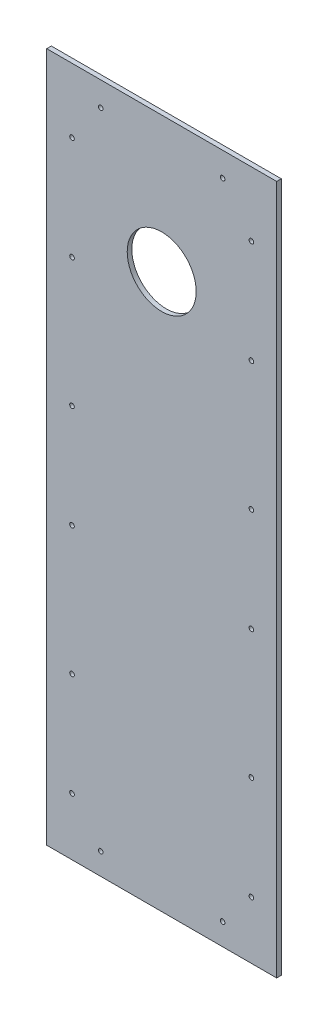
ISO-10303-21;
HEADER;
FILE_DESCRIPTION(('STEP AP214'),'2;1');
FILE_NAME('part.step','',(''),(''),'','','');
FILE_SCHEMA(('AUTOMOTIVE_DESIGN { 1 0 10303 214 1 1 1 1 }'));
ENDSEC;
DATA;
#1=APPLICATION_CONTEXT('core data for automotive mechanical design processes');
#2=APPLICATION_PROTOCOL_DEFINITION('international standard','automotive_design',2000,#1);
#3=PRODUCT_CONTEXT('',#1,'mechanical');
#4=PRODUCT('Part','Part','',(#3));
#5=PRODUCT_RELATED_PRODUCT_CATEGORY('part','',(#4));
#6=PRODUCT_DEFINITION_FORMATION('','',#4);
#7=PRODUCT_DEFINITION_CONTEXT('part definition',#1,'design');
#8=PRODUCT_DEFINITION('design','',#6,#7);
#9=PRODUCT_DEFINITION_SHAPE('','',#8);
#10=(LENGTH_UNIT() NAMED_UNIT(*) SI_UNIT(.MILLI.,.METRE.));
#11=(NAMED_UNIT(*) PLANE_ANGLE_UNIT() SI_UNIT($,.RADIAN.));
#12=(NAMED_UNIT(*) SI_UNIT($,.STERADIAN.) SOLID_ANGLE_UNIT());
#13=UNCERTAINTY_MEASURE_WITH_UNIT(LENGTH_MEASURE(1.E-05),#10,'distance_accuracy_value','');
#14=(GEOMETRIC_REPRESENTATION_CONTEXT(3) GLOBAL_UNCERTAINTY_ASSIGNED_CONTEXT((#13)) GLOBAL_UNIT_ASSIGNED_CONTEXT((#10,
#11,#12)) REPRESENTATION_CONTEXT('',''));
#15=CARTESIAN_POINT('',(0.,0.,0.));
#16=DIRECTION('',(0.,0.,1.));
#17=DIRECTION('',(1.,0.,0.));
#18=AXIS2_PLACEMENT_3D('',#15,#16,#17);
#19=CARTESIAN_POINT('',(-50.,-150.,2.));
#20=DIRECTION('',(1.,0.,0.));
#21=DIRECTION('',(0.,0.,-1.));
#22=AXIS2_PLACEMENT_3D('',#19,#20,#21);
#23=PLANE('',#22);
#24=DIRECTION('',(0.,-1.,0.));
#25=VECTOR('',#24,1.);
#26=CARTESIAN_POINT('',(-50.,-150.,0.));
#27=LINE('',#26,#25);
#28=CARTESIAN_POINT('',(-50.,150.,0.));
#29=VERTEX_POINT('',#28);
#30=CARTESIAN_POINT('',(-50.,-150.,0.));
#31=VERTEX_POINT('',#30);
#32=EDGE_CURVE('E107',#29,#31,#27,.T.);
#33=ORIENTED_EDGE('',*,*,#32,.T.);
#34=DIRECTION('',(0.,0.,-1.));
#35=VECTOR('',#34,1.);
#36=CARTESIAN_POINT('',(-50.,-150.,2.));
#37=LINE('',#36,#35);
#38=CARTESIAN_POINT('',(-50.,-150.,2.));
#39=VERTEX_POINT('',#38);
#40=EDGE_CURVE('E11',#39,#31,#37,.T.);
#41=ORIENTED_EDGE('',*,*,#40,.F.);
#42=DIRECTION('',(0.,-1.,0.));
#43=VECTOR('',#42,1.);
#44=CARTESIAN_POINT('',(-50.,-150.,2.));
#45=LINE('',#44,#43);
#46=CARTESIAN_POINT('',(-50.,150.,2.));
#47=VERTEX_POINT('',#46);
#48=EDGE_CURVE('E94',#47,#39,#45,.T.);
#49=ORIENTED_EDGE('',*,*,#48,.F.);
#50=DIRECTION('',(0.,0.,-1.));
#51=VECTOR('',#50,1.);
#52=CARTESIAN_POINT('',(-50.,150.,2.));
#53=LINE('',#52,#51);
#54=EDGE_CURVE('E103',#47,#29,#53,.T.);
#55=ORIENTED_EDGE('',*,*,#54,.T.);
#56=EDGE_LOOP('',(#33,#41,#49,#55));
#57=FACE_BOUND('',#56,.T.);
#58=ADVANCED_FACE('F41',(#57),#23,.F.);
#59=CARTESIAN_POINT('',(50.,-150.,2.));
#60=DIRECTION('',(0.,1.,0.));
#61=DIRECTION('',(0.,0.,1.));
#62=AXIS2_PLACEMENT_3D('',#59,#60,#61);
#63=PLANE('',#62);
#64=DIRECTION('',(1.,0.,0.));
#65=VECTOR('',#64,1.);
#66=CARTESIAN_POINT('',(50.,-150.,0.));
#67=LINE('',#66,#65);
#68=CARTESIAN_POINT('',(50.,-150.,0.));
#69=VERTEX_POINT('',#68);
#70=EDGE_CURVE('E98',#31,#69,#67,.T.);
#71=ORIENTED_EDGE('',*,*,#70,.T.);
#72=DIRECTION('',(0.,0.,-1.));
#73=VECTOR('',#72,1.);
#74=CARTESIAN_POINT('',(50.,-150.,2.));
#75=LINE('',#74,#73);
#76=CARTESIAN_POINT('',(50.,-150.,2.));
#77=VERTEX_POINT('',#76);
#78=EDGE_CURVE('E50',#77,#69,#75,.T.);
#79=ORIENTED_EDGE('',*,*,#78,.F.);
#80=DIRECTION('',(1.,0.,0.));
#81=VECTOR('',#80,1.);
#82=CARTESIAN_POINT('',(50.,-150.,2.));
#83=LINE('',#82,#81);
#84=EDGE_CURVE('E89',#39,#77,#83,.T.);
#85=ORIENTED_EDGE('',*,*,#84,.F.);
#86=ORIENTED_EDGE('',*,*,#40,.T.);
#87=EDGE_LOOP('',(#71,#79,#85,#86));
#88=FACE_BOUND('',#87,.T.);
#89=ADVANCED_FACE('F97',(#88),#63,.F.);
#90=CARTESIAN_POINT('',(50.,-150.,2.));
#91=DIRECTION('',(-1.,0.,0.));
#92=DIRECTION('',(0.,0.,1.));
#93=AXIS2_PLACEMENT_3D('',#90,#91,#92);
#94=PLANE('',#93);
#95=DIRECTION('',(0.,1.,0.));
#96=VECTOR('',#95,1.);
#97=CARTESIAN_POINT('',(50.,-150.,0.));
#98=LINE('',#97,#96);
#99=CARTESIAN_POINT('',(50.,150.,0.));
#100=VERTEX_POINT('',#99);
#101=EDGE_CURVE('E76',#69,#100,#98,.T.);
#102=ORIENTED_EDGE('',*,*,#101,.T.);
#103=DIRECTION('',(0.,0.,-1.));
#104=VECTOR('',#103,1.);
#105=CARTESIAN_POINT('',(50.,150.,2.));
#106=LINE('',#105,#104);
#107=CARTESIAN_POINT('',(50.,150.,2.));
#108=VERTEX_POINT('',#107);
#109=EDGE_CURVE('E99',#108,#100,#106,.T.);
#110=ORIENTED_EDGE('',*,*,#109,.F.);
#111=DIRECTION('',(0.,1.,0.));
#112=VECTOR('',#111,1.);
#113=CARTESIAN_POINT('',(50.,-150.,2.));
#114=LINE('',#113,#112);
#115=EDGE_CURVE('E92',#77,#108,#114,.T.);
#116=ORIENTED_EDGE('',*,*,#115,.F.);
#117=ORIENTED_EDGE('',*,*,#78,.T.);
#118=EDGE_LOOP('',(#102,#110,#116,#117));
#119=FACE_BOUND('',#118,.T.);
#120=ADVANCED_FACE('F101',(#119),#94,.F.);
#121=CARTESIAN_POINT('',(50.,150.,2.));
#122=DIRECTION('',(0.,-1.,0.));
#123=DIRECTION('',(1.,0.,0.));
#124=AXIS2_PLACEMENT_3D('',#121,#122,#123);
#125=PLANE('',#124);
#126=DIRECTION('',(-1.,0.,0.));
#127=VECTOR('',#126,1.);
#128=CARTESIAN_POINT('',(50.,150.,0.));
#129=LINE('',#128,#127);
#130=EDGE_CURVE('E82',#100,#29,#129,.T.);
#131=ORIENTED_EDGE('',*,*,#130,.T.);
#132=ORIENTED_EDGE('',*,*,#54,.F.);
#133=DIRECTION('',(-1.,0.,0.));
#134=VECTOR('',#133,1.);
#135=CARTESIAN_POINT('',(50.,150.,2.));
#136=LINE('',#135,#134);
#137=EDGE_CURVE('E59',#108,#47,#136,.T.);
#138=ORIENTED_EDGE('',*,*,#137,.F.);
#139=ORIENTED_EDGE('',*,*,#109,.T.);
#140=EDGE_LOOP('',(#131,#132,#138,#139));
#141=FACE_BOUND('',#140,.T.);
#142=ADVANCED_FACE('F191',(#141),#125,.F.);
#143=CARTESIAN_POINT('',(0.,0.,2.));
#144=DIRECTION('',(0.,0.,1.));
#145=DIRECTION('',(1.,0.,0.));
#146=AXIS2_PLACEMENT_3D('',#143,#144,#145);
#147=PLANE('',#146);
#148=CARTESIAN_POINT('',(-26.5,139.5,2.));
#149=DIRECTION('',(0.,0.,1.));
#150=DIRECTION('',(1.,0.,0.));
#151=AXIS2_PLACEMENT_3D('',#148,#149,#150);
#152=CIRCLE('',#151,0.999999999999998);
#153=CARTESIAN_POINT('',(-25.5,139.5,2.));
#154=VERTEX_POINT('',#153);
#155=EDGE_CURVE('E350',#154,#154,#152,.T.);
#156=ORIENTED_EDGE('',*,*,#155,.F.);
#157=EDGE_LOOP('',(#156));
#158=FACE_BOUND('',#157,.T.);
#159=CARTESIAN_POINT('',(26.5,-140.5,2.));
#160=DIRECTION('',(0.,0.,1.));
#161=DIRECTION('',(1.,0.,0.));
#162=AXIS2_PLACEMENT_3D('',#159,#160,#161);
#163=CIRCLE('',#162,1.);
#164=CARTESIAN_POINT('',(27.5,-140.5,2.));
#165=VERTEX_POINT('',#164);
#166=EDGE_CURVE('E369',#165,#165,#163,.T.);
#167=ORIENTED_EDGE('',*,*,#166,.F.);
#168=EDGE_LOOP('',(#167));
#169=FACE_BOUND('',#168,.T.);
#170=CARTESIAN_POINT('',(-26.5,-140.5,2.));
#171=DIRECTION('',(0.,0.,1.));
#172=DIRECTION('',(1.,0.,0.));
#173=AXIS2_PLACEMENT_3D('',#170,#171,#172);
#174=CIRCLE('',#173,0.999999999999998);
#175=CARTESIAN_POINT('',(-25.5,-140.5,2.));
#176=VERTEX_POINT('',#175);
#177=EDGE_CURVE('E366',#176,#176,#174,.T.);
#178=ORIENTED_EDGE('',*,*,#177,.F.);
#179=EDGE_LOOP('',(#178));
#180=FACE_BOUND('',#179,.T.);
#181=CARTESIAN_POINT('',(26.5,139.5,2.));
#182=DIRECTION('',(0.,0.,1.));
#183=DIRECTION('',(1.,0.,0.));
#184=AXIS2_PLACEMENT_3D('',#181,#182,#183);
#185=CIRCLE('',#184,1.);
#186=CARTESIAN_POINT('',(27.5,139.5,2.));
#187=VERTEX_POINT('',#186);
#188=EDGE_CURVE('E357',#187,#187,#185,.T.);
#189=ORIENTED_EDGE('',*,*,#188,.F.);
#190=EDGE_LOOP('',(#189));
#191=FACE_BOUND('',#190,.T.);
#192=CARTESIAN_POINT('',(0.,91.,2.));
#193=DIRECTION('',(0.,0.,1.));
#194=DIRECTION('',(1.,0.,0.));
#195=AXIS2_PLACEMENT_3D('',#192,#193,#194);
#196=CIRCLE('',#195,15.);
#197=CARTESIAN_POINT('',(15.,91.,2.));
#198=VERTEX_POINT('',#197);
#199=EDGE_CURVE('E376',#198,#198,#196,.T.);
#200=ORIENTED_EDGE('',*,*,#199,.F.);
#201=EDGE_LOOP('',(#200));
#202=FACE_BOUND('',#201,.T.);
#203=CARTESIAN_POINT('',(-39.,-23.9999999999995,2.));
#204=DIRECTION('',(0.,0.,1.));
#205=DIRECTION('',(1.,0.,0.));
#206=AXIS2_PLACEMENT_3D('',#203,#204,#205);
#207=CIRCLE('',#206,0.999999999999998);
#208=CARTESIAN_POINT('',(-38.,-23.9999999999995,2.));
#209=VERTEX_POINT('',#208);
#210=EDGE_CURVE('E395',#209,#209,#207,.T.);
#211=ORIENTED_EDGE('',*,*,#210,.F.);
#212=EDGE_LOOP('',(#211));
#213=FACE_BOUND('',#212,.T.);
#214=CARTESIAN_POINT('',(39.,21.,2.));
#215=DIRECTION('',(0.,0.,1.));
#216=DIRECTION('',(1.,0.,0.));
#217=AXIS2_PLACEMENT_3D('',#214,#215,#216);
#218=CIRCLE('',#217,0.999999999999998);
#219=CARTESIAN_POINT('',(40.,21.,2.));
#220=VERTEX_POINT('',#219);
#221=EDGE_CURVE('E392',#220,#220,#218,.T.);
#222=ORIENTED_EDGE('',*,*,#221,.F.);
#223=EDGE_LOOP('',(#222));
#224=FACE_BOUND('',#223,.T.);
#225=CARTESIAN_POINT('',(39.,-23.9999999999995,2.));
#226=DIRECTION('',(0.,0.,1.));
#227=DIRECTION('',(1.,0.,0.));
#228=AXIS2_PLACEMENT_3D('',#225,#226,#227);
#229=CIRCLE('',#228,0.999999999999998);
#230=CARTESIAN_POINT('',(40.,-23.9999999999995,2.));
#231=VERTEX_POINT('',#230);
#232=EDGE_CURVE('E389',#231,#231,#229,.T.);
#233=ORIENTED_EDGE('',*,*,#232,.F.);
#234=EDGE_LOOP('',(#233));
#235=FACE_BOUND('',#234,.T.);
#236=CARTESIAN_POINT('',(-39.,-80.,2.));
#237=DIRECTION('',(0.,0.,1.));
#238=DIRECTION('',(1.,0.,0.));
#239=AXIS2_PLACEMENT_3D('',#236,#237,#238);
#240=CIRCLE('',#239,0.999999999999998);
#241=CARTESIAN_POINT('',(-38.,-80.,2.));
#242=VERTEX_POINT('',#241);
#243=EDGE_CURVE('E386',#242,#242,#240,.T.);
#244=ORIENTED_EDGE('',*,*,#243,.F.);
#245=EDGE_LOOP('',(#244));
#246=FACE_BOUND('',#245,.T.);
#247=CARTESIAN_POINT('',(-39.,77.0000000000005,2.));
#248=DIRECTION('',(0.,0.,1.));
#249=DIRECTION('',(1.,0.,0.));
#250=AXIS2_PLACEMENT_3D('',#247,#248,#249);
#251=CIRCLE('',#250,0.999999999999998);
#252=CARTESIAN_POINT('',(-38.,77.0000000000005,2.));
#253=VERTEX_POINT('',#252);
#254=EDGE_CURVE('E406',#253,#253,#251,.T.);
#255=ORIENTED_EDGE('',*,*,#254,.F.);
#256=EDGE_LOOP('',(#255));
#257=FACE_BOUND('',#256,.T.);
#258=CARTESIAN_POINT('',(39.,122.,2.));
#259=DIRECTION('',(0.,0.,1.));
#260=DIRECTION('',(1.,0.,0.));
#261=AXIS2_PLACEMENT_3D('',#258,#259,#260);
#262=CIRCLE('',#261,0.999999999999998);
#263=CARTESIAN_POINT('',(40.,122.,2.));
#264=VERTEX_POINT('',#263);
#265=EDGE_CURVE('E403',#264,#264,#262,.T.);
#266=ORIENTED_EDGE('',*,*,#265,.F.);
#267=EDGE_LOOP('',(#266));
#268=FACE_BOUND('',#267,.T.);
#269=CARTESIAN_POINT('',(39.,77.0000000000005,2.));
#270=DIRECTION('',(0.,0.,1.));
#271=DIRECTION('',(1.,0.,0.));
#272=AXIS2_PLACEMENT_3D('',#269,#270,#271);
#273=CIRCLE('',#272,0.999999999999998);
#274=CARTESIAN_POINT('',(40.,77.0000000000005,2.));
#275=VERTEX_POINT('',#274);
#276=EDGE_CURVE('E400',#275,#275,#273,.T.);
#277=ORIENTED_EDGE('',*,*,#276,.F.);
#278=EDGE_LOOP('',(#277));
#279=FACE_BOUND('',#278,.T.);
#280=CARTESIAN_POINT('',(-39.,21.,2.));
#281=DIRECTION('',(0.,0.,1.));
#282=DIRECTION('',(1.,0.,0.));
#283=AXIS2_PLACEMENT_3D('',#280,#281,#282);
#284=CIRCLE('',#283,0.999999999999998);
#285=CARTESIAN_POINT('',(-38.,21.,2.));
#286=VERTEX_POINT('',#285);
#287=EDGE_CURVE('E397',#286,#286,#284,.T.);
#288=ORIENTED_EDGE('',*,*,#287,.F.);
#289=EDGE_LOOP('',(#288));
#290=FACE_BOUND('',#289,.T.);
#291=CARTESIAN_POINT('',(39.,-125.,2.));
#292=DIRECTION('',(0.,0.,1.));
#293=DIRECTION('',(1.,0.,0.));
#294=AXIS2_PLACEMENT_3D('',#291,#292,#293);
#295=CIRCLE('',#294,0.999999999999998);
#296=CARTESIAN_POINT('',(40.,-125.,2.));
#297=VERTEX_POINT('',#296);
#298=EDGE_CURVE('E379',#297,#297,#295,.T.);
#299=ORIENTED_EDGE('',*,*,#298,.F.);
#300=EDGE_LOOP('',(#299));
#301=FACE_BOUND('',#300,.T.);
#302=CARTESIAN_POINT('',(39.,-80.,2.));
#303=DIRECTION('',(0.,0.,1.));
#304=DIRECTION('',(1.,0.,0.));
#305=AXIS2_PLACEMENT_3D('',#302,#303,#304);
#306=CIRCLE('',#305,0.999999999999998);
#307=CARTESIAN_POINT('',(40.,-80.,2.));
#308=VERTEX_POINT('',#307);
#309=EDGE_CURVE('E382',#308,#308,#306,.T.);
#310=ORIENTED_EDGE('',*,*,#309,.F.);
#311=EDGE_LOOP('',(#310));
#312=FACE_BOUND('',#311,.T.);
#313=CARTESIAN_POINT('',(-39.,-125.,2.));
#314=DIRECTION('',(0.,0.,1.));
#315=DIRECTION('',(1.,0.,0.));
#316=AXIS2_PLACEMENT_3D('',#313,#314,#315);
#317=CIRCLE('',#316,0.999999999999998);
#318=CARTESIAN_POINT('',(-38.,-125.,2.));
#319=VERTEX_POINT('',#318);
#320=EDGE_CURVE('E383',#319,#319,#317,.T.);
#321=ORIENTED_EDGE('',*,*,#320,.F.);
#322=EDGE_LOOP('',(#321));
#323=FACE_BOUND('',#322,.T.);
#324=CARTESIAN_POINT('',(-39.,122.,2.));
#325=DIRECTION('',(0.,0.,1.));
#326=DIRECTION('',(1.,0.,0.));
#327=AXIS2_PLACEMENT_3D('',#324,#325,#326);
#328=CIRCLE('',#327,0.999999999999998);
#329=CARTESIAN_POINT('',(-38.,122.,2.));
#330=VERTEX_POINT('',#329);
#331=EDGE_CURVE('E119',#330,#330,#328,.T.);
#332=ORIENTED_EDGE('',*,*,#331,.F.);
#333=EDGE_LOOP('',(#332));
#334=FACE_BOUND('',#333,.T.);
#335=ORIENTED_EDGE('',*,*,#48,.T.);
#336=ORIENTED_EDGE('',*,*,#84,.T.);
#337=ORIENTED_EDGE('',*,*,#115,.T.);
#338=ORIENTED_EDGE('',*,*,#137,.T.);
#339=EDGE_LOOP('',(#335,#336,#337,#338));
#340=FACE_BOUND('',#339,.T.);
#341=ADVANCED_FACE('F90',(#158,#169,#180,#191,#202,#213,#224,#235,#246,#257,#268,#279,#290,#301,
#312,#323,#334,#340),#147,.T.);
#342=CARTESIAN_POINT('',(0.,0.,0.));
#343=DIRECTION('',(0.,0.,1.));
#344=DIRECTION('',(1.,0.,0.));
#345=AXIS2_PLACEMENT_3D('',#342,#343,#344);
#346=PLANE('',#345);
#347=CARTESIAN_POINT('',(-26.5,139.5,0.));
#348=DIRECTION('',(0.,0.,-1.));
#349=DIRECTION('',(-1.,0.,0.));
#350=AXIS2_PLACEMENT_3D('',#347,#348,#349);
#351=CIRCLE('',#350,0.999999999999998);
#352=CARTESIAN_POINT('',(-27.5,139.5,0.));
#353=VERTEX_POINT('',#352);
#354=EDGE_CURVE('E352',#353,#353,#351,.T.);
#355=ORIENTED_EDGE('',*,*,#354,.F.);
#356=EDGE_LOOP('',(#355));
#357=FACE_BOUND('',#356,.T.);
#358=CARTESIAN_POINT('',(26.5,-140.5,0.));
#359=DIRECTION('',(0.,0.,-1.));
#360=DIRECTION('',(-1.,0.,0.));
#361=AXIS2_PLACEMENT_3D('',#358,#359,#360);
#362=CIRCLE('',#361,1.);
#363=CARTESIAN_POINT('',(25.5,-140.5,0.));
#364=VERTEX_POINT('',#363);
#365=EDGE_CURVE('E354',#364,#364,#362,.T.);
#366=ORIENTED_EDGE('',*,*,#365,.F.);
#367=EDGE_LOOP('',(#366));
#368=FACE_BOUND('',#367,.T.);
#369=CARTESIAN_POINT('',(-26.5,-140.5,0.));
#370=DIRECTION('',(0.,0.,-1.));
#371=DIRECTION('',(-1.,0.,0.));
#372=AXIS2_PLACEMENT_3D('',#369,#370,#371);
#373=CIRCLE('',#372,0.999999999999998);
#374=CARTESIAN_POINT('',(-27.5,-140.5,0.));
#375=VERTEX_POINT('',#374);
#376=EDGE_CURVE('E360',#375,#375,#373,.T.);
#377=ORIENTED_EDGE('',*,*,#376,.F.);
#378=EDGE_LOOP('',(#377));
#379=FACE_BOUND('',#378,.T.);
#380=CARTESIAN_POINT('',(26.5,139.5,0.));
#381=DIRECTION('',(0.,0.,-1.));
#382=DIRECTION('',(-1.,0.,0.));
#383=AXIS2_PLACEMENT_3D('',#380,#381,#382);
#384=CIRCLE('',#383,1.);
#385=CARTESIAN_POINT('',(25.5,139.5,0.));
#386=VERTEX_POINT('',#385);
#387=EDGE_CURVE('E353',#386,#386,#384,.T.);
#388=ORIENTED_EDGE('',*,*,#387,.F.);
#389=EDGE_LOOP('',(#388));
#390=FACE_BOUND('',#389,.T.);
#391=CARTESIAN_POINT('',(0.,91.,0.));
#392=DIRECTION('',(0.,0.,-1.));
#393=DIRECTION('',(-1.,0.,0.));
#394=AXIS2_PLACEMENT_3D('',#391,#392,#393);
#395=CIRCLE('',#394,15.);
#396=CARTESIAN_POINT('',(-15.,91.,0.));
#397=VERTEX_POINT('',#396);
#398=EDGE_CURVE('E373',#397,#397,#395,.T.);
#399=ORIENTED_EDGE('',*,*,#398,.F.);
#400=EDGE_LOOP('',(#399));
#401=FACE_BOUND('',#400,.T.);
#402=CARTESIAN_POINT('',(-39.,-23.9999999999995,0.));
#403=DIRECTION('',(0.,0.,1.));
#404=DIRECTION('',(1.,0.,0.));
#405=AXIS2_PLACEMENT_3D('',#402,#403,#404);
#406=CIRCLE('',#405,0.999999999999998);
#407=CARTESIAN_POINT('',(-38.,-23.9999999999995,0.));
#408=VERTEX_POINT('',#407);
#409=EDGE_CURVE('E44',#408,#408,#406,.T.);
#410=ORIENTED_EDGE('',*,*,#409,.T.);
#411=EDGE_LOOP('',(#410));
#412=FACE_BOUND('',#411,.T.);
#413=CARTESIAN_POINT('',(39.,21.,0.));
#414=DIRECTION('',(0.,0.,1.));
#415=DIRECTION('',(1.,0.,0.));
#416=AXIS2_PLACEMENT_3D('',#413,#414,#415);
#417=CIRCLE('',#416,0.999999999999998);
#418=CARTESIAN_POINT('',(40.,21.,0.));
#419=VERTEX_POINT('',#418);
#420=EDGE_CURVE('E145',#419,#419,#417,.T.);
#421=ORIENTED_EDGE('',*,*,#420,.T.);
#422=EDGE_LOOP('',(#421));
#423=FACE_BOUND('',#422,.T.);
#424=CARTESIAN_POINT('',(39.,-23.9999999999995,0.));
#425=DIRECTION('',(0.,0.,1.));
#426=DIRECTION('',(1.,0.,0.));
#427=AXIS2_PLACEMENT_3D('',#424,#425,#426);
#428=CIRCLE('',#427,0.999999999999998);
#429=CARTESIAN_POINT('',(40.,-23.9999999999995,0.));
#430=VERTEX_POINT('',#429);
#431=EDGE_CURVE('E143',#430,#430,#428,.T.);
#432=ORIENTED_EDGE('',*,*,#431,.T.);
#433=EDGE_LOOP('',(#432));
#434=FACE_BOUND('',#433,.T.);
#435=CARTESIAN_POINT('',(-39.,-80.,0.));
#436=DIRECTION('',(0.,0.,1.));
#437=DIRECTION('',(1.,0.,0.));
#438=AXIS2_PLACEMENT_3D('',#435,#436,#437);
#439=CIRCLE('',#438,0.999999999999998);
#440=CARTESIAN_POINT('',(-38.,-80.,0.));
#441=VERTEX_POINT('',#440);
#442=EDGE_CURVE('E140',#441,#441,#439,.T.);
#443=ORIENTED_EDGE('',*,*,#442,.T.);
#444=EDGE_LOOP('',(#443));
#445=FACE_BOUND('',#444,.T.);
#446=CARTESIAN_POINT('',(-39.,77.0000000000005,0.));
#447=DIRECTION('',(0.,0.,1.));
#448=DIRECTION('',(1.,0.,0.));
#449=AXIS2_PLACEMENT_3D('',#446,#447,#448);
#450=CIRCLE('',#449,0.999999999999998);
#451=CARTESIAN_POINT('',(-38.,77.0000000000005,0.));
#452=VERTEX_POINT('',#451);
#453=EDGE_CURVE('E137',#452,#452,#450,.T.);
#454=ORIENTED_EDGE('',*,*,#453,.T.);
#455=EDGE_LOOP('',(#454));
#456=FACE_BOUND('',#455,.T.);
#457=CARTESIAN_POINT('',(39.,122.,0.));
#458=DIRECTION('',(0.,0.,1.));
#459=DIRECTION('',(1.,0.,0.));
#460=AXIS2_PLACEMENT_3D('',#457,#458,#459);
#461=CIRCLE('',#460,0.999999999999998);
#462=CARTESIAN_POINT('',(40.,122.,0.));
#463=VERTEX_POINT('',#462);
#464=EDGE_CURVE('E134',#463,#463,#461,.T.);
#465=ORIENTED_EDGE('',*,*,#464,.T.);
#466=EDGE_LOOP('',(#465));
#467=FACE_BOUND('',#466,.T.);
#468=CARTESIAN_POINT('',(39.,77.0000000000005,0.));
#469=DIRECTION('',(0.,0.,1.));
#470=DIRECTION('',(1.,0.,0.));
#471=AXIS2_PLACEMENT_3D('',#468,#469,#470);
#472=CIRCLE('',#471,0.999999999999998);
#473=CARTESIAN_POINT('',(40.,77.0000000000005,0.));
#474=VERTEX_POINT('',#473);
#475=EDGE_CURVE('E131',#474,#474,#472,.T.);
#476=ORIENTED_EDGE('',*,*,#475,.T.);
#477=EDGE_LOOP('',(#476));
#478=FACE_BOUND('',#477,.T.);
#479=CARTESIAN_POINT('',(-39.,21.,0.));
#480=DIRECTION('',(0.,0.,1.));
#481=DIRECTION('',(1.,0.,0.));
#482=AXIS2_PLACEMENT_3D('',#479,#480,#481);
#483=CIRCLE('',#482,0.999999999999998);
#484=CARTESIAN_POINT('',(-38.,21.,0.));
#485=VERTEX_POINT('',#484);
#486=EDGE_CURVE('E128',#485,#485,#483,.T.);
#487=ORIENTED_EDGE('',*,*,#486,.T.);
#488=EDGE_LOOP('',(#487));
#489=FACE_BOUND('',#488,.T.);
#490=CARTESIAN_POINT('',(39.,-125.,0.));
#491=DIRECTION('',(0.,0.,1.));
#492=DIRECTION('',(1.,0.,0.));
#493=AXIS2_PLACEMENT_3D('',#490,#491,#492);
#494=CIRCLE('',#493,0.999999999999998);
#495=CARTESIAN_POINT('',(40.,-125.,0.));
#496=VERTEX_POINT('',#495);
#497=EDGE_CURVE('E125',#496,#496,#494,.T.);
#498=ORIENTED_EDGE('',*,*,#497,.T.);
#499=EDGE_LOOP('',(#498));
#500=FACE_BOUND('',#499,.T.);
#501=CARTESIAN_POINT('',(39.,-80.,0.));
#502=DIRECTION('',(0.,0.,1.));
#503=DIRECTION('',(1.,0.,0.));
#504=AXIS2_PLACEMENT_3D('',#501,#502,#503);
#505=CIRCLE('',#504,0.999999999999998);
#506=CARTESIAN_POINT('',(40.,-80.,0.));
#507=VERTEX_POINT('',#506);
#508=EDGE_CURVE('E122',#507,#507,#505,.T.);
#509=ORIENTED_EDGE('',*,*,#508,.T.);
#510=EDGE_LOOP('',(#509));
#511=FACE_BOUND('',#510,.T.);
#512=CARTESIAN_POINT('',(-39.,-125.,0.));
#513=DIRECTION('',(0.,0.,1.));
#514=DIRECTION('',(1.,0.,0.));
#515=AXIS2_PLACEMENT_3D('',#512,#513,#514);
#516=CIRCLE('',#515,0.999999999999998);
#517=CARTESIAN_POINT('',(-38.,-125.,0.));
#518=VERTEX_POINT('',#517);
#519=EDGE_CURVE('E118',#518,#518,#516,.T.);
#520=ORIENTED_EDGE('',*,*,#519,.T.);
#521=EDGE_LOOP('',(#520));
#522=FACE_BOUND('',#521,.T.);
#523=CARTESIAN_POINT('',(-39.,122.,0.));
#524=DIRECTION('',(0.,0.,1.));
#525=DIRECTION('',(1.,0.,0.));
#526=AXIS2_PLACEMENT_3D('',#523,#524,#525);
#527=CIRCLE('',#526,0.999999999999998);
#528=CARTESIAN_POINT('',(-38.,122.,0.));
#529=VERTEX_POINT('',#528);
#530=EDGE_CURVE('E115',#529,#529,#527,.T.);
#531=ORIENTED_EDGE('',*,*,#530,.T.);
#532=EDGE_LOOP('',(#531));
#533=FACE_BOUND('',#532,.T.);
#534=ORIENTED_EDGE('',*,*,#32,.F.);
#535=ORIENTED_EDGE('',*,*,#130,.F.);
#536=ORIENTED_EDGE('',*,*,#101,.F.);
#537=ORIENTED_EDGE('',*,*,#70,.F.);
#538=EDGE_LOOP('',(#534,#535,#536,#537));
#539=FACE_BOUND('',#538,.T.);
#540=ADVANCED_FACE('F152',(#357,#368,#379,#390,#401,#412,#423,#434,#445,#456,#467,#478,#489,
#500,#511,#522,#533,#539),#346,.F.);
#541=CARTESIAN_POINT('',(-39.,122.,-8.));
#542=DIRECTION('',(0.,0.,1.));
#543=DIRECTION('',(1.,0.,0.));
#544=AXIS2_PLACEMENT_3D('',#541,#542,#543);
#545=CYLINDRICAL_SURFACE('',#544,0.999999999999998);
#546=ORIENTED_EDGE('',*,*,#331,.T.);
#547=EDGE_LOOP('',(#546));
#548=FACE_BOUND('',#547,.T.);
#549=ORIENTED_EDGE('',*,*,#530,.F.);
#550=EDGE_LOOP('',(#549));
#551=FACE_BOUND('',#550,.T.);
#552=ADVANCED_FACE('F180',(#548,#551),#545,.F.);
#553=CARTESIAN_POINT('',(-39.,-125.,-8.));
#554=DIRECTION('',(0.,0.,1.));
#555=DIRECTION('',(1.,0.,0.));
#556=AXIS2_PLACEMENT_3D('',#553,#554,#555);
#557=CYLINDRICAL_SURFACE('',#556,0.999999999999998);
#558=ORIENTED_EDGE('',*,*,#320,.T.);
#559=EDGE_LOOP('',(#558));
#560=FACE_BOUND('',#559,.T.);
#561=ORIENTED_EDGE('',*,*,#519,.F.);
#562=EDGE_LOOP('',(#561));
#563=FACE_BOUND('',#562,.T.);
#564=ADVANCED_FACE('F188',(#560,#563),#557,.F.);
#565=CARTESIAN_POINT('',(39.,-80.,-8.));
#566=DIRECTION('',(0.,0.,1.));
#567=DIRECTION('',(1.,0.,0.));
#568=AXIS2_PLACEMENT_3D('',#565,#566,#567);
#569=CYLINDRICAL_SURFACE('',#568,0.999999999999998);
#570=ORIENTED_EDGE('',*,*,#309,.T.);
#571=EDGE_LOOP('',(#570));
#572=FACE_BOUND('',#571,.T.);
#573=ORIENTED_EDGE('',*,*,#508,.F.);
#574=EDGE_LOOP('',(#573));
#575=FACE_BOUND('',#574,.T.);
#576=ADVANCED_FACE('F229',(#572,#575),#569,.F.);
#577=CARTESIAN_POINT('',(39.,-125.,-8.));
#578=DIRECTION('',(0.,0.,1.));
#579=DIRECTION('',(1.,0.,0.));
#580=AXIS2_PLACEMENT_3D('',#577,#578,#579);
#581=CYLINDRICAL_SURFACE('',#580,0.999999999999998);
#582=ORIENTED_EDGE('',*,*,#298,.T.);
#583=EDGE_LOOP('',(#582));
#584=FACE_BOUND('',#583,.T.);
#585=ORIENTED_EDGE('',*,*,#497,.F.);
#586=EDGE_LOOP('',(#585));
#587=FACE_BOUND('',#586,.T.);
#588=ADVANCED_FACE('F237',(#584,#587),#581,.F.);
#589=CARTESIAN_POINT('',(-39.,21.,-8.));
#590=DIRECTION('',(0.,0.,1.));
#591=DIRECTION('',(1.,0.,0.));
#592=AXIS2_PLACEMENT_3D('',#589,#590,#591);
#593=CYLINDRICAL_SURFACE('',#592,0.999999999999998);
#594=ORIENTED_EDGE('',*,*,#287,.T.);
#595=EDGE_LOOP('',(#594));
#596=FACE_BOUND('',#595,.T.);
#597=ORIENTED_EDGE('',*,*,#486,.F.);
#598=EDGE_LOOP('',(#597));
#599=FACE_BOUND('',#598,.T.);
#600=ADVANCED_FACE('F245',(#596,#599),#593,.F.);
#601=CARTESIAN_POINT('',(39.,77.0000000000005,-8.));
#602=DIRECTION('',(0.,0.,1.));
#603=DIRECTION('',(1.,0.,0.));
#604=AXIS2_PLACEMENT_3D('',#601,#602,#603);
#605=CYLINDRICAL_SURFACE('',#604,0.999999999999998);
#606=ORIENTED_EDGE('',*,*,#276,.T.);
#607=EDGE_LOOP('',(#606));
#608=FACE_BOUND('',#607,.T.);
#609=ORIENTED_EDGE('',*,*,#475,.F.);
#610=EDGE_LOOP('',(#609));
#611=FACE_BOUND('',#610,.T.);
#612=ADVANCED_FACE('F253',(#608,#611),#605,.F.);
#613=CARTESIAN_POINT('',(39.,122.,-8.));
#614=DIRECTION('',(0.,0.,1.));
#615=DIRECTION('',(1.,0.,0.));
#616=AXIS2_PLACEMENT_3D('',#613,#614,#615);
#617=CYLINDRICAL_SURFACE('',#616,0.999999999999998);
#618=ORIENTED_EDGE('',*,*,#265,.T.);
#619=EDGE_LOOP('',(#618));
#620=FACE_BOUND('',#619,.T.);
#621=ORIENTED_EDGE('',*,*,#464,.F.);
#622=EDGE_LOOP('',(#621));
#623=FACE_BOUND('',#622,.T.);
#624=ADVANCED_FACE('F261',(#620,#623),#617,.F.);
#625=CARTESIAN_POINT('',(-39.,77.0000000000005,-8.));
#626=DIRECTION('',(0.,0.,1.));
#627=DIRECTION('',(1.,0.,0.));
#628=AXIS2_PLACEMENT_3D('',#625,#626,#627);
#629=CYLINDRICAL_SURFACE('',#628,0.999999999999998);
#630=ORIENTED_EDGE('',*,*,#254,.T.);
#631=EDGE_LOOP('',(#630));
#632=FACE_BOUND('',#631,.T.);
#633=ORIENTED_EDGE('',*,*,#453,.F.);
#634=EDGE_LOOP('',(#633));
#635=FACE_BOUND('',#634,.T.);
#636=ADVANCED_FACE('F269',(#632,#635),#629,.F.);
#637=CARTESIAN_POINT('',(-39.,-80.,-8.));
#638=DIRECTION('',(0.,0.,1.));
#639=DIRECTION('',(1.,0.,0.));
#640=AXIS2_PLACEMENT_3D('',#637,#638,#639);
#641=CYLINDRICAL_SURFACE('',#640,0.999999999999998);
#642=ORIENTED_EDGE('',*,*,#243,.T.);
#643=EDGE_LOOP('',(#642));
#644=FACE_BOUND('',#643,.T.);
#645=ORIENTED_EDGE('',*,*,#442,.F.);
#646=EDGE_LOOP('',(#645));
#647=FACE_BOUND('',#646,.T.);
#648=ADVANCED_FACE('F277',(#644,#647),#641,.F.);
#649=CARTESIAN_POINT('',(39.,-23.9999999999995,-8.));
#650=DIRECTION('',(0.,0.,1.));
#651=DIRECTION('',(1.,0.,0.));
#652=AXIS2_PLACEMENT_3D('',#649,#650,#651);
#653=CYLINDRICAL_SURFACE('',#652,0.999999999999998);
#654=ORIENTED_EDGE('',*,*,#232,.T.);
#655=EDGE_LOOP('',(#654));
#656=FACE_BOUND('',#655,.T.);
#657=ORIENTED_EDGE('',*,*,#431,.F.);
#658=EDGE_LOOP('',(#657));
#659=FACE_BOUND('',#658,.T.);
#660=ADVANCED_FACE('F167',(#656,#659),#653,.F.);
#661=CARTESIAN_POINT('',(39.,21.,-8.));
#662=DIRECTION('',(0.,0.,1.));
#663=DIRECTION('',(1.,0.,0.));
#664=AXIS2_PLACEMENT_3D('',#661,#662,#663);
#665=CYLINDRICAL_SURFACE('',#664,0.999999999999998);
#666=ORIENTED_EDGE('',*,*,#221,.T.);
#667=EDGE_LOOP('',(#666));
#668=FACE_BOUND('',#667,.T.);
#669=ORIENTED_EDGE('',*,*,#420,.F.);
#670=EDGE_LOOP('',(#669));
#671=FACE_BOUND('',#670,.T.);
#672=ADVANCED_FACE('F157',(#668,#671),#665,.F.);
#673=CARTESIAN_POINT('',(-39.,-23.9999999999995,-8.));
#674=DIRECTION('',(0.,0.,1.));
#675=DIRECTION('',(1.,0.,0.));
#676=AXIS2_PLACEMENT_3D('',#673,#674,#675);
#677=CYLINDRICAL_SURFACE('',#676,0.999999999999998);
#678=ORIENTED_EDGE('',*,*,#210,.T.);
#679=EDGE_LOOP('',(#678));
#680=FACE_BOUND('',#679,.T.);
#681=ORIENTED_EDGE('',*,*,#409,.F.);
#682=EDGE_LOOP('',(#681));
#683=FACE_BOUND('',#682,.T.);
#684=ADVANCED_FACE('F154',(#680,#683),#677,.F.);
#685=CARTESIAN_POINT('',(0.,91.,10.));
#686=DIRECTION('',(0.,0.,-1.));
#687=DIRECTION('',(-1.,0.,0.));
#688=AXIS2_PLACEMENT_3D('',#685,#686,#687);
#689=CYLINDRICAL_SURFACE('',#688,15.);
#690=ORIENTED_EDGE('',*,*,#199,.T.);
#691=EDGE_LOOP('',(#690));
#692=FACE_BOUND('',#691,.T.);
#693=ORIENTED_EDGE('',*,*,#398,.T.);
#694=EDGE_LOOP('',(#693));
#695=FACE_BOUND('',#694,.T.);
#696=ADVANCED_FACE('F156',(#692,#695),#689,.F.);
#697=CARTESIAN_POINT('',(26.5,139.5,10.));
#698=DIRECTION('',(0.,0.,-1.));
#699=DIRECTION('',(-1.,0.,0.));
#700=AXIS2_PLACEMENT_3D('',#697,#698,#699);
#701=CYLINDRICAL_SURFACE('',#700,1.);
#702=ORIENTED_EDGE('',*,*,#188,.T.);
#703=EDGE_LOOP('',(#702));
#704=FACE_BOUND('',#703,.T.);
#705=ORIENTED_EDGE('',*,*,#387,.T.);
#706=EDGE_LOOP('',(#705));
#707=FACE_BOUND('',#706,.T.);
#708=ADVANCED_FACE('F164',(#704,#707),#701,.F.);
#709=CARTESIAN_POINT('',(-26.5,-140.5,10.));
#710=DIRECTION('',(0.,0.,-1.));
#711=DIRECTION('',(-1.,0.,0.));
#712=AXIS2_PLACEMENT_3D('',#709,#710,#711);
#713=CYLINDRICAL_SURFACE('',#712,0.999999999999998);
#714=ORIENTED_EDGE('',*,*,#177,.T.);
#715=EDGE_LOOP('',(#714));
#716=FACE_BOUND('',#715,.T.);
#717=ORIENTED_EDGE('',*,*,#376,.T.);
#718=EDGE_LOOP('',(#717));
#719=FACE_BOUND('',#718,.T.);
#720=ADVANCED_FACE('F313',(#716,#719),#713,.F.);
#721=CARTESIAN_POINT('',(26.5,-140.5,10.));
#722=DIRECTION('',(0.,0.,-1.));
#723=DIRECTION('',(-1.,0.,0.));
#724=AXIS2_PLACEMENT_3D('',#721,#722,#723);
#725=CYLINDRICAL_SURFACE('',#724,1.);
#726=ORIENTED_EDGE('',*,*,#166,.T.);
#727=EDGE_LOOP('',(#726));
#728=FACE_BOUND('',#727,.T.);
#729=ORIENTED_EDGE('',*,*,#365,.T.);
#730=EDGE_LOOP('',(#729));
#731=FACE_BOUND('',#730,.T.);
#732=ADVANCED_FACE('F320',(#728,#731),#725,.F.);
#733=CARTESIAN_POINT('',(-26.5,139.5,10.));
#734=DIRECTION('',(0.,0.,-1.));
#735=DIRECTION('',(-1.,0.,0.));
#736=AXIS2_PLACEMENT_3D('',#733,#734,#735);
#737=CYLINDRICAL_SURFACE('',#736,0.999999999999998);
#738=ORIENTED_EDGE('',*,*,#155,.T.);
#739=EDGE_LOOP('',(#738));
#740=FACE_BOUND('',#739,.T.);
#741=ORIENTED_EDGE('',*,*,#354,.T.);
#742=EDGE_LOOP('',(#741));
#743=FACE_BOUND('',#742,.T.);
#744=ADVANCED_FACE('F328',(#740,#743),#737,.F.);
#745=CLOSED_SHELL('',(#58,#89,#120,#142,#341,#540,#552,#564,#576,#588,#600,#612,#624,#636,#648,
#660,#672,#684,#696,#708,#720,#732,#744));
#746=MANIFOLD_SOLID_BREP('B2',#745);
#747=ADVANCED_BREP_SHAPE_REPRESENTATION('',(#18,#746),#14);
#748=SHAPE_DEFINITION_REPRESENTATION(#9,#747);
ENDSEC;
END-ISO-10303-21;
